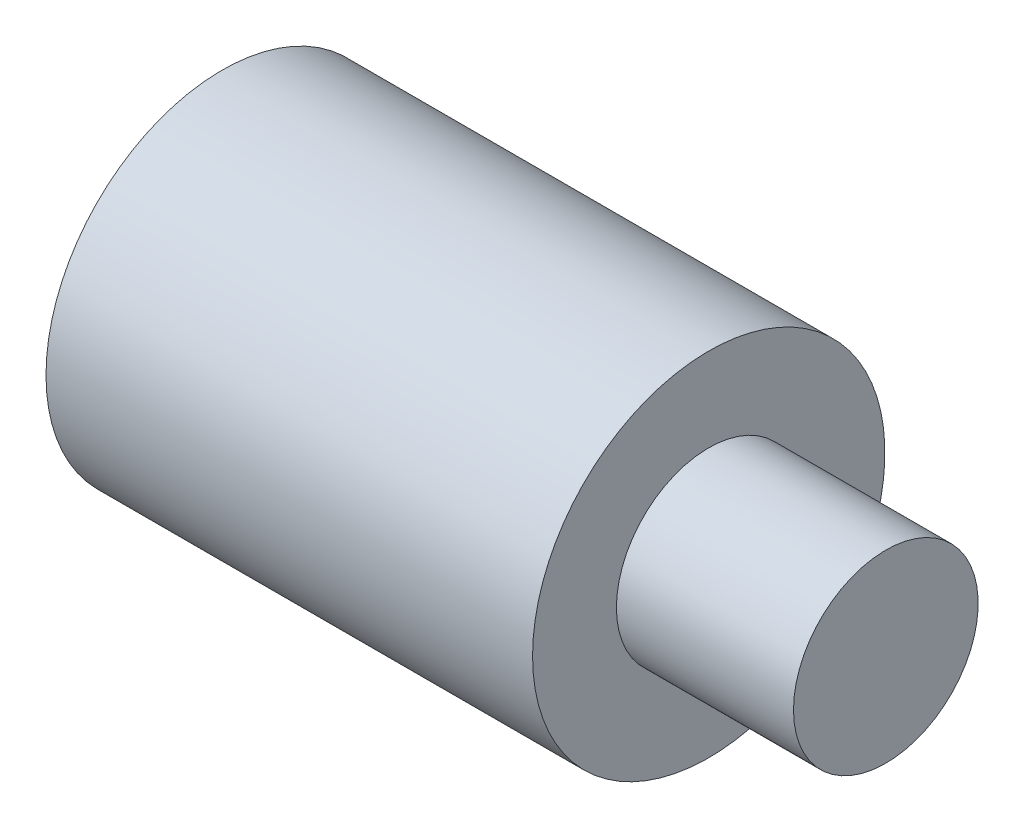
ISO-10303-21;
HEADER;
FILE_DESCRIPTION(('STEP AP214'),'2;1');
FILE_NAME('part.step','',(''),(''),'','','');
FILE_SCHEMA(('AUTOMOTIVE_DESIGN { 1 0 10303 214 1 1 1 1 }'));
ENDSEC;
DATA;
#1=APPLICATION_CONTEXT('core data for automotive mechanical design processes');
#2=APPLICATION_PROTOCOL_DEFINITION('international standard','automotive_design',2000,#1);
#3=PRODUCT_CONTEXT('',#1,'mechanical');
#4=PRODUCT('Part','Part','',(#3));
#5=PRODUCT_RELATED_PRODUCT_CATEGORY('part','',(#4));
#6=PRODUCT_DEFINITION_FORMATION('','',#4);
#7=PRODUCT_DEFINITION_CONTEXT('part definition',#1,'design');
#8=PRODUCT_DEFINITION('design','',#6,#7);
#9=PRODUCT_DEFINITION_SHAPE('','',#8);
#10=(LENGTH_UNIT() NAMED_UNIT(*) SI_UNIT(.MILLI.,.METRE.));
#11=(NAMED_UNIT(*) PLANE_ANGLE_UNIT() SI_UNIT($,.RADIAN.));
#12=(NAMED_UNIT(*) SI_UNIT($,.STERADIAN.) SOLID_ANGLE_UNIT());
#13=UNCERTAINTY_MEASURE_WITH_UNIT(LENGTH_MEASURE(1.E-05),#10,'distance_accuracy_value','');
#14=(GEOMETRIC_REPRESENTATION_CONTEXT(3) GLOBAL_UNCERTAINTY_ASSIGNED_CONTEXT((#13)) GLOBAL_UNIT_ASSIGNED_CONTEXT((#10,
#11,#12)) REPRESENTATION_CONTEXT('',''));
#15=CARTESIAN_POINT('',(0.,0.,0.));
#16=DIRECTION('',(0.,0.,1.));
#17=DIRECTION('',(1.,0.,0.));
#18=AXIS2_PLACEMENT_3D('',#15,#16,#17);
#19=CARTESIAN_POINT('',(9.5,0.,0.));
#20=DIRECTION('',(-1.,0.,0.));
#21=DIRECTION('',(0.,0.,1.));
#22=AXIS2_PLACEMENT_3D('',#19,#20,#21);
#23=PLANE('',#22);
#24=CARTESIAN_POINT('',(9.50000000000006,0.,0.));
#25=DIRECTION('',(-1.,0.,0.));
#26=DIRECTION('',(0.,0.,1.));
#27=AXIS2_PLACEMENT_3D('',#24,#25,#26);
#28=CIRCLE('',#27,4.953);
#29=CARTESIAN_POINT('',(9.50000000000006,0.,4.953));
#30=VERTEX_POINT('',#29);
#31=EDGE_CURVE('E10',#30,#30,#28,.T.);
#32=ORIENTED_EDGE('',*,*,#31,.F.);
#33=EDGE_LOOP('',(#32));
#34=FACE_BOUND('',#33,.T.);
#35=ADVANCED_FACE('F39',(#34),#23,.F.);
#36=CARTESIAN_POINT('',(-1000.,0.,0.));
#37=DIRECTION('',(-1.,0.,0.));
#38=DIRECTION('',(0.,0.,1.));
#39=AXIS2_PLACEMENT_3D('',#36,#37,#38);
#40=CYLINDRICAL_SURFACE('',#39,4.953);
#41=CARTESIAN_POINT('',(0.,0.,0.));
#42=DIRECTION('',(-1.,0.,0.));
#43=DIRECTION('',(0.,0.,1.));
#44=AXIS2_PLACEMENT_3D('',#41,#42,#43);
#45=CIRCLE('',#44,4.953);
#46=CARTESIAN_POINT('',(0.,0.,4.953));
#47=VERTEX_POINT('',#46);
#48=EDGE_CURVE('E46',#47,#47,#45,.T.);
#49=ORIENTED_EDGE('',*,*,#48,.F.);
#50=EDGE_LOOP('',(#49));
#51=FACE_BOUND('',#50,.T.);
#52=ORIENTED_EDGE('',*,*,#31,.T.);
#53=EDGE_LOOP('',(#52));
#54=FACE_BOUND('',#53,.T.);
#55=ADVANCED_FACE('F84',(#51,#54),#40,.T.);
#56=CARTESIAN_POINT('',(0.,4.953,0.));
#57=DIRECTION('',(-1.,0.,0.));
#58=DIRECTION('',(0.,0.,1.));
#59=AXIS2_PLACEMENT_3D('',#56,#57,#58);
#60=PLANE('',#59);
#61=CARTESIAN_POINT('',(0.,0.,0.));
#62=DIRECTION('',(-1.,0.,0.));
#63=DIRECTION('',(0.,0.,1.));
#64=AXIS2_PLACEMENT_3D('',#61,#62,#63);
#65=CIRCLE('',#64,9.45);
#66=CARTESIAN_POINT('',(0.,0.,9.45));
#67=VERTEX_POINT('',#66);
#68=EDGE_CURVE('E49',#67,#67,#65,.T.);
#69=ORIENTED_EDGE('',*,*,#68,.F.);
#70=EDGE_LOOP('',(#69));
#71=FACE_BOUND('',#70,.T.);
#72=ORIENTED_EDGE('',*,*,#48,.T.);
#73=EDGE_LOOP('',(#72));
#74=FACE_BOUND('',#73,.T.);
#75=ADVANCED_FACE('F79',(#71,#74),#60,.F.);
#76=CARTESIAN_POINT('',(-1000.,0.,0.));
#77=DIRECTION('',(-1.,0.,0.));
#78=DIRECTION('',(0.,0.,1.));
#79=AXIS2_PLACEMENT_3D('',#76,#77,#78);
#80=CYLINDRICAL_SURFACE('',#79,9.45);
#81=CARTESIAN_POINT('',(-26.1,0.,0.));
#82=DIRECTION('',(-1.,0.,0.));
#83=DIRECTION('',(0.,0.,1.));
#84=AXIS2_PLACEMENT_3D('',#81,#82,#83);
#85=CIRCLE('',#84,9.45);
#86=CARTESIAN_POINT('',(-26.1,0.,9.45));
#87=VERTEX_POINT('',#86);
#88=EDGE_CURVE('E54',#87,#87,#85,.T.);
#89=ORIENTED_EDGE('',*,*,#88,.F.);
#90=EDGE_LOOP('',(#89));
#91=FACE_BOUND('',#90,.T.);
#92=ORIENTED_EDGE('',*,*,#68,.T.);
#93=EDGE_LOOP('',(#92));
#94=FACE_BOUND('',#93,.T.);
#95=ADVANCED_FACE('F68',(#91,#94),#80,.T.);
#96=CARTESIAN_POINT('',(-26.1,9.45,0.));
#97=DIRECTION('',(1.,0.,0.));
#98=DIRECTION('',(0.,0.,-1.));
#99=AXIS2_PLACEMENT_3D('',#96,#97,#98);
#100=PLANE('',#99);
#101=CARTESIAN_POINT('',(-26.1,0.,0.));
#102=DIRECTION('',(1.,0.,0.));
#103=DIRECTION('',(0.,0.,-1.));
#104=AXIS2_PLACEMENT_3D('',#101,#102,#103);
#105=CIRCLE('',#104,4.7625);
#106=CARTESIAN_POINT('',(-26.1,0.,-4.7625));
#107=VERTEX_POINT('',#106);
#108=EDGE_CURVE('E45',#107,#107,#105,.F.);
#109=ORIENTED_EDGE('',*,*,#108,.F.);
#110=EDGE_LOOP('',(#109));
#111=FACE_BOUND('',#110,.T.);
#112=ORIENTED_EDGE('',*,*,#88,.T.);
#113=EDGE_LOOP('',(#112));
#114=FACE_BOUND('',#113,.T.);
#115=ADVANCED_FACE('F69',(#111,#114),#100,.F.);
#116=CARTESIAN_POINT('',(-1000.,0.,0.));
#117=DIRECTION('',(-1.,0.,0.));
#118=DIRECTION('',(0.,0.,1.));
#119=AXIS2_PLACEMENT_3D('',#116,#117,#118);
#120=CYLINDRICAL_SURFACE('',#119,4.7625);
#121=CARTESIAN_POINT('',(-9.29999999999998,0.,0.));
#122=DIRECTION('',(-1.,0.,0.));
#123=DIRECTION('',(0.,0.,1.));
#124=AXIS2_PLACEMENT_3D('',#121,#122,#123);
#125=CIRCLE('',#124,4.7625);
#126=CARTESIAN_POINT('',(-9.29999999999998,0.,4.7625));
#127=VERTEX_POINT('',#126);
#128=EDGE_CURVE('E59',#127,#127,#125,.T.);
#129=ORIENTED_EDGE('',*,*,#128,.F.);
#130=EDGE_LOOP('',(#129));
#131=FACE_BOUND('',#130,.T.);
#132=ORIENTED_EDGE('',*,*,#108,.T.);
#133=EDGE_LOOP('',(#132));
#134=FACE_BOUND('',#133,.T.);
#135=ADVANCED_FACE('F62',(#131,#134),#120,.F.);
#136=CARTESIAN_POINT('',(-9.3,4.7625,0.));
#137=DIRECTION('',(-1.,0.,0.));
#138=DIRECTION('',(0.,0.,1.));
#139=AXIS2_PLACEMENT_3D('',#136,#137,#138);
#140=PLANE('',#139);
#141=ORIENTED_EDGE('',*,*,#128,.T.);
#142=EDGE_LOOP('',(#141));
#143=FACE_BOUND('',#142,.T.);
#144=ADVANCED_FACE('F94',(#143),#140,.T.);
#145=CLOSED_SHELL('',(#35,#55,#75,#95,#115,#135,#144));
#146=MANIFOLD_SOLID_BREP('B2',#145);
#147=ADVANCED_BREP_SHAPE_REPRESENTATION('',(#18,#146),#14);
#148=SHAPE_DEFINITION_REPRESENTATION(#9,#147);
ENDSEC;
END-ISO-10303-21;
